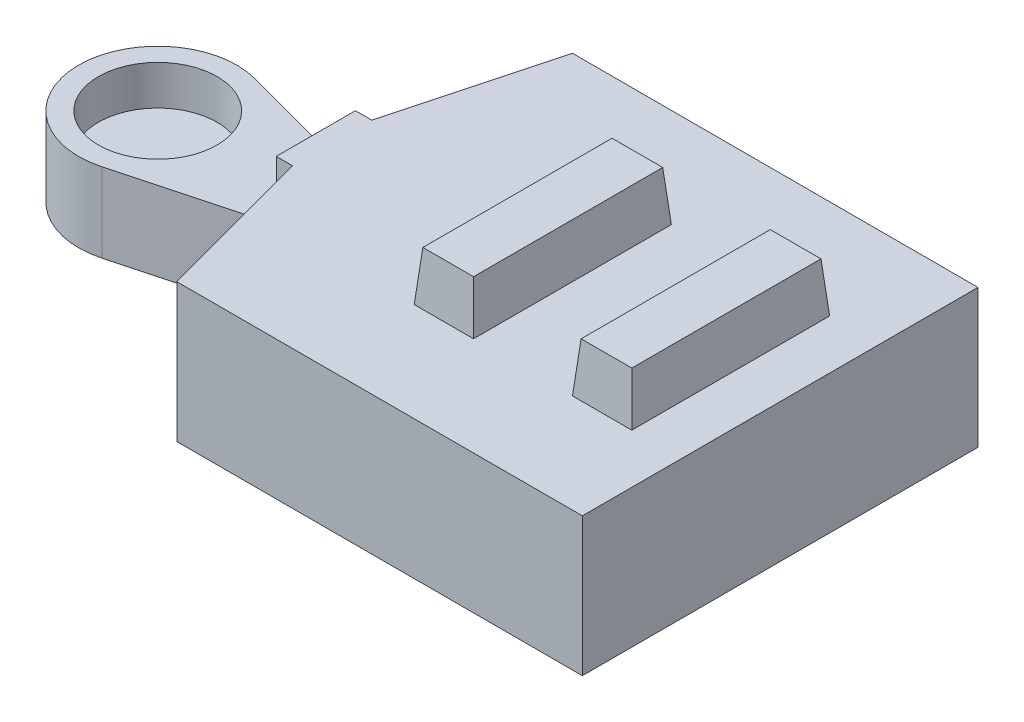
ISO-10303-21;
HEADER;
FILE_DESCRIPTION(('STEP AP214'),'2;1');
FILE_NAME('part.step','',(''),(''),'','','');
FILE_SCHEMA(('AUTOMOTIVE_DESIGN { 1 0 10303 214 1 1 1 1 }'));
ENDSEC;
DATA;
#1=APPLICATION_CONTEXT('core data for automotive mechanical design processes');
#2=APPLICATION_PROTOCOL_DEFINITION('international standard','automotive_design',2000,#1);
#3=PRODUCT_CONTEXT('',#1,'mechanical');
#4=PRODUCT('Part','Part','',(#3));
#5=PRODUCT_RELATED_PRODUCT_CATEGORY('part','',(#4));
#6=PRODUCT_DEFINITION_FORMATION('','',#4);
#7=PRODUCT_DEFINITION_CONTEXT('part definition',#1,'design');
#8=PRODUCT_DEFINITION('design','',#6,#7);
#9=PRODUCT_DEFINITION_SHAPE('','',#8);
#10=(LENGTH_UNIT() NAMED_UNIT(*) SI_UNIT(.MILLI.,.METRE.));
#11=(NAMED_UNIT(*) PLANE_ANGLE_UNIT() SI_UNIT($,.RADIAN.));
#12=(NAMED_UNIT(*) SI_UNIT($,.STERADIAN.) SOLID_ANGLE_UNIT());
#13=UNCERTAINTY_MEASURE_WITH_UNIT(LENGTH_MEASURE(1.E-05),#10,'distance_accuracy_value','');
#14=(GEOMETRIC_REPRESENTATION_CONTEXT(3) GLOBAL_UNCERTAINTY_ASSIGNED_CONTEXT((#13)) GLOBAL_UNIT_ASSIGNED_CONTEXT((#10,
#11,#12)) REPRESENTATION_CONTEXT('',''));
#15=CARTESIAN_POINT('',(0.,0.,0.));
#16=DIRECTION('',(0.,0.,1.));
#17=DIRECTION('',(1.,0.,0.));
#18=AXIS2_PLACEMENT_3D('',#15,#16,#17);
#19=CARTESIAN_POINT('',(0.,9.5,0.));
#20=DIRECTION('',(0.,1.,0.));
#21=DIRECTION('',(0.,0.,1.));
#22=AXIS2_PLACEMENT_3D('',#19,#20,#21);
#23=PLANE('',#22);
#24=DIRECTION('',(1.,0.,0.));
#25=VECTOR('',#24,1.);
#26=CARTESIAN_POINT('',(-4.,9.5,4.78127834118521));
#27=LINE('',#26,#25);
#28=CARTESIAN_POINT('',(26.1828232739526,9.5,4.78127834118521));
#29=VERTEX_POINT('',#28);
#30=CARTESIAN_POINT('',(28.745379956323,9.5,4.78127834118521));
#31=VERTEX_POINT('',#30);
#32=EDGE_CURVE('E322',#29,#31,#27,.T.);
#33=ORIENTED_EDGE('',*,*,#32,.T.);
#34=DIRECTION('',(0.,0.,-1.));
#35=VECTOR('',#34,1.);
#36=CARTESIAN_POINT('',(28.745379956323,9.5,7.50954959385838));
#37=LINE('',#36,#35);
#38=CARTESIAN_POINT('',(28.745379956323,9.5,-4.78127834118518));
#39=VERTEX_POINT('',#38);
#40=EDGE_CURVE('E332',#31,#39,#37,.T.);
#41=ORIENTED_EDGE('',*,*,#40,.T.);
#42=DIRECTION('',(1.,0.,0.));
#43=VECTOR('',#42,1.);
#44=CARTESIAN_POINT('',(-4.,9.5,-4.78127834118518));
#45=LINE('',#44,#43);
#46=CARTESIAN_POINT('',(26.1828232739526,9.5,-4.78127834118518));
#47=VERTEX_POINT('',#46);
#48=EDGE_CURVE('E62',#47,#39,#45,.T.);
#49=ORIENTED_EDGE('',*,*,#48,.F.);
#50=DIRECTION('',(0.,0.,-1.));
#51=VECTOR('',#50,1.);
#52=CARTESIAN_POINT('',(26.1828232739526,9.5,7.50954959385838));
#53=LINE('',#52,#51);
#54=EDGE_CURVE('E317',#29,#47,#53,.T.);
#55=ORIENTED_EDGE('',*,*,#54,.F.);
#56=EDGE_LOOP('',(#33,#41,#49,#55));
#57=FACE_BOUND('',#56,.T.);
#58=ADVANCED_FACE('F39',(#57),#23,.T.);
#59=CARTESIAN_POINT('',(0.,9.5,0.));
#60=DIRECTION('',(0.,1.,0.));
#61=DIRECTION('',(0.,0.,1.));
#62=AXIS2_PLACEMENT_3D('',#59,#60,#61);
#63=PLANE('',#62);
#64=CARTESIAN_POINT('',(18.1828232739526,9.5,4.78127834118521));
#65=VERTEX_POINT('',#64);
#66=CARTESIAN_POINT('',(20.745379956323,9.5,4.78127834118521));
#67=VERTEX_POINT('',#66);
#68=EDGE_CURVE('E318',#65,#67,#27,.T.);
#69=ORIENTED_EDGE('',*,*,#68,.T.);
#70=DIRECTION('',(0.,0.,-1.));
#71=VECTOR('',#70,1.);
#72=CARTESIAN_POINT('',(20.745379956323,9.5,7.50954959385838));
#73=LINE('',#72,#71);
#74=CARTESIAN_POINT('',(20.745379956323,9.5,-4.78127834118518));
#75=VERTEX_POINT('',#74);
#76=EDGE_CURVE('E335',#67,#75,#73,.T.);
#77=ORIENTED_EDGE('',*,*,#76,.T.);
#78=CARTESIAN_POINT('',(18.1828232739526,9.5,-4.78127834118518));
#79=VERTEX_POINT('',#78);
#80=EDGE_CURVE('E54',#79,#75,#45,.T.);
#81=ORIENTED_EDGE('',*,*,#80,.F.);
#82=DIRECTION('',(0.,0.,-1.));
#83=VECTOR('',#82,1.);
#84=CARTESIAN_POINT('',(18.1828232739526,9.5,7.50954959385838));
#85=LINE('',#84,#83);
#86=EDGE_CURVE('E187',#65,#79,#85,.T.);
#87=ORIENTED_EDGE('',*,*,#86,.F.);
#88=EDGE_LOOP('',(#69,#77,#81,#87));
#89=FACE_BOUND('',#88,.T.);
#90=ADVANCED_FACE('F344',(#89),#63,.T.);
#91=CARTESIAN_POINT('',(17.9641016151378,7.,7.50954959385838));
#92=DIRECTION('',(0.996194698091746,-0.0871557427476526,0.));
#93=DIRECTION('',(0.0871557427476526,0.996194698091746,0.));
#94=AXIS2_PLACEMENT_3D('',#91,#92,#93);
#95=PLANE('',#94);
#96=DIRECTION('',(0.,0.,1.));
#97=VECTOR('',#96,1.);
#98=CARTESIAN_POINT('',(17.9641016151378,7.,-5.));
#99=LINE('',#98,#97);
#100=CARTESIAN_POINT('',(17.9641016151378,7.,-4.99999999999999));
#101=VERTEX_POINT('',#100);
#102=CARTESIAN_POINT('',(17.9641016151378,7.,5.00000000000001));
#103=VERTEX_POINT('',#102);
#104=EDGE_CURVE('E177',#101,#103,#99,.T.);
#105=ORIENTED_EDGE('',*,*,#104,.T.);
#106=DIRECTION('',(0.0868265938642421,0.992432509138968,-0.0868265938642407));
#107=VECTOR('',#106,1.);
#108=CARTESIAN_POINT('',(17.9451824786062,6.78375327992174,5.01891913653152));
#109=LINE('',#108,#107);
#110=EDGE_CURVE('E330',#103,#65,#109,.T.);
#111=ORIENTED_EDGE('',*,*,#110,.T.);
#112=ORIENTED_EDGE('',*,*,#86,.T.);
#113=DIRECTION('',(0.086826593864242,0.992432509138967,0.0868265938642482));
#114=VECTOR('',#113,1.);
#115=CARTESIAN_POINT('',(18.0584093256899,8.07794206416514,-4.90569228944781));
#116=LINE('',#115,#114);
#117=EDGE_CURVE('E171',#101,#79,#116,.T.);
#118=ORIENTED_EDGE('',*,*,#117,.F.);
#119=EDGE_LOOP('',(#105,#111,#112,#118));
#120=FACE_BOUND('',#119,.T.);
#121=ADVANCED_FACE('F183',(#120),#95,.F.);
#122=CARTESIAN_POINT('',(20.9641016151378,7.,7.50954959385838));
#123=DIRECTION('',(-0.996194698091746,-0.0871557427476512,0.));
#124=DIRECTION('',(0.0871557427476512,-0.996194698091746,0.));
#125=AXIS2_PLACEMENT_3D('',#122,#123,#124);
#126=PLANE('',#125);
#127=ORIENTED_EDGE('',*,*,#76,.F.);
#128=DIRECTION('',(0.0868265938642407,-0.992432509138968,0.0868265938642407));
#129=VECTOR('',#128,1.);
#130=CARTESIAN_POINT('',(20.9830207516693,6.78375327992174,5.01891913653152));
#131=LINE('',#130,#129);
#132=CARTESIAN_POINT('',(20.9641016151378,7.,5.00000000000001));
#133=VERTEX_POINT('',#132);
#134=EDGE_CURVE('E327',#67,#133,#131,.T.);
#135=ORIENTED_EDGE('',*,*,#134,.T.);
#136=DIRECTION('',(0.,0.,-1.));
#137=VECTOR('',#136,1.);
#138=CARTESIAN_POINT('',(20.9641016151378,7.,-5.));
#139=LINE('',#138,#137);
#140=CARTESIAN_POINT('',(20.9641016151378,7.,-4.99999999999999));
#141=VERTEX_POINT('',#140);
#142=EDGE_CURVE('E178',#133,#141,#139,.T.);
#143=ORIENTED_EDGE('',*,*,#142,.T.);
#144=DIRECTION('',(0.0868265938642407,-0.992432509138968,-0.0868265938642482));
#145=VECTOR('',#144,1.);
#146=CARTESIAN_POINT('',(20.8697939045856,8.07794206416514,-4.90569228944781));
#147=LINE('',#146,#145);
#148=EDGE_CURVE('E172',#75,#141,#147,.T.);
#149=ORIENTED_EDGE('',*,*,#148,.F.);
#150=EDGE_LOOP('',(#127,#135,#143,#149));
#151=FACE_BOUND('',#150,.T.);
#152=ADVANCED_FACE('F340',(#151),#126,.F.);
#153=CARTESIAN_POINT('',(25.9641016151378,7.,7.50954959385838));
#154=DIRECTION('',(0.996194698091746,-0.0871557427476512,0.));
#155=DIRECTION('',(0.0871557427476512,0.996194698091746,0.));
#156=AXIS2_PLACEMENT_3D('',#153,#154,#155);
#157=PLANE('',#156);
#158=DIRECTION('',(0.,0.,1.));
#159=VECTOR('',#158,1.);
#160=CARTESIAN_POINT('',(25.9641016151378,7.,-4.99999999999999));
#161=LINE('',#160,#159);
#162=CARTESIAN_POINT('',(25.9641016151378,7.,-4.99999999999999));
#163=VERTEX_POINT('',#162);
#164=CARTESIAN_POINT('',(25.9641016151378,7.,5.00000000000001));
#165=VERTEX_POINT('',#164);
#166=EDGE_CURVE('E202',#163,#165,#161,.T.);
#167=ORIENTED_EDGE('',*,*,#166,.T.);
#168=DIRECTION('',(0.0868265938642407,0.992432509138968,-0.0868265938642407));
#169=VECTOR('',#168,1.);
#170=CARTESIAN_POINT('',(25.9451824786062,6.78375327992174,5.01891913653152));
#171=LINE('',#170,#169);
#172=EDGE_CURVE('E188',#165,#29,#171,.T.);
#173=ORIENTED_EDGE('',*,*,#172,.T.);
#174=ORIENTED_EDGE('',*,*,#54,.T.);
#175=DIRECTION('',(0.0868265938642407,0.992432509138968,0.0868265938642482));
#176=VECTOR('',#175,1.);
#177=CARTESIAN_POINT('',(26.0584093256899,8.07794206416514,-4.90569228944781));
#178=LINE('',#177,#176);
#179=EDGE_CURVE('E316',#163,#47,#178,.T.);
#180=ORIENTED_EDGE('',*,*,#179,.F.);
#181=EDGE_LOOP('',(#167,#173,#174,#180));
#182=FACE_BOUND('',#181,.T.);
#183=ADVANCED_FACE('F313',(#182),#157,.F.);
#184=CARTESIAN_POINT('',(28.9641016151378,7.,7.50954959385838));
#185=DIRECTION('',(-0.996194698091746,-0.0871557427476512,0.));
#186=DIRECTION('',(0.0871557427476512,-0.996194698091746,0.));
#187=AXIS2_PLACEMENT_3D('',#184,#185,#186);
#188=PLANE('',#187);
#189=ORIENTED_EDGE('',*,*,#40,.F.);
#190=DIRECTION('',(0.0868265938642407,-0.992432509138968,0.0868265938642407));
#191=VECTOR('',#190,1.);
#192=CARTESIAN_POINT('',(28.9830207516693,6.78375327992174,5.01891913653152));
#193=LINE('',#192,#191);
#194=CARTESIAN_POINT('',(28.9641016151378,7.,5.00000000000001));
#195=VERTEX_POINT('',#194);
#196=EDGE_CURVE('E11',#31,#195,#193,.T.);
#197=ORIENTED_EDGE('',*,*,#196,.T.);
#198=DIRECTION('',(0.,0.,-1.));
#199=VECTOR('',#198,1.);
#200=CARTESIAN_POINT('',(28.9641016151378,7.,-4.99999999999999));
#201=LINE('',#200,#199);
#202=CARTESIAN_POINT('',(28.9641016151378,7.,-4.99999999999999));
#203=VERTEX_POINT('',#202);
#204=EDGE_CURVE('E194',#195,#203,#201,.T.);
#205=ORIENTED_EDGE('',*,*,#204,.T.);
#206=DIRECTION('',(0.0868265938642407,-0.992432509138968,-0.0868265938642482));
#207=VECTOR('',#206,1.);
#208=CARTESIAN_POINT('',(28.8697939045856,8.07794206416514,-4.90569228944781));
#209=LINE('',#208,#207);
#210=EDGE_CURVE('E47',#39,#203,#209,.T.);
#211=ORIENTED_EDGE('',*,*,#210,.F.);
#212=EDGE_LOOP('',(#189,#197,#205,#211));
#213=FACE_BOUND('',#212,.T.);
#214=ADVANCED_FACE('F307',(#213),#188,.F.);
#215=CARTESIAN_POINT('',(0.,7.,0.));
#216=DIRECTION('',(0.,-1.,0.));
#217=DIRECTION('',(0.,0.,-1.));
#218=AXIS2_PLACEMENT_3D('',#215,#216,#217);
#219=PLANE('',#218);
#220=DIRECTION('',(1.,0.,0.));
#221=VECTOR('',#220,1.);
#222=CARTESIAN_POINT('',(17.9641016151378,7.,5.));
#223=LINE('',#222,#221);
#224=EDGE_CURVE('E192',#103,#133,#223,.T.);
#225=ORIENTED_EDGE('',*,*,#224,.F.);
#226=ORIENTED_EDGE('',*,*,#104,.F.);
#227=DIRECTION('',(-1.,0.,0.));
#228=VECTOR('',#227,1.);
#229=CARTESIAN_POINT('',(17.9641016151378,7.,-5.));
#230=LINE('',#229,#228);
#231=EDGE_CURVE('E168',#141,#101,#230,.T.);
#232=ORIENTED_EDGE('',*,*,#231,.F.);
#233=ORIENTED_EDGE('',*,*,#142,.F.);
#234=EDGE_LOOP('',(#225,#226,#232,#233));
#235=FACE_BOUND('',#234,.T.);
#236=DIRECTION('',(1.,0.,0.));
#237=VECTOR('',#236,1.);
#238=CARTESIAN_POINT('',(25.9641016151378,7.,5.00000000000001));
#239=LINE('',#238,#237);
#240=EDGE_CURVE('E205',#165,#195,#239,.T.);
#241=ORIENTED_EDGE('',*,*,#240,.F.);
#242=ORIENTED_EDGE('',*,*,#166,.F.);
#243=DIRECTION('',(-1.,0.,0.));
#244=VECTOR('',#243,1.);
#245=CARTESIAN_POINT('',(25.9641016151378,7.,-4.99999999999999));
#246=LINE('',#245,#244);
#247=EDGE_CURVE('E200',#203,#163,#246,.T.);
#248=ORIENTED_EDGE('',*,*,#247,.F.);
#249=ORIENTED_EDGE('',*,*,#204,.F.);
#250=EDGE_LOOP('',(#241,#242,#248,#249));
#251=FACE_BOUND('',#250,.T.);
#252=DIRECTION('',(-0.258819045102522,0.,0.965925826289068));
#253=VECTOR('',#252,1.);
#254=CARTESIAN_POINT('',(8.81810782814292,7.,-2.));
#255=LINE('',#254,#253);
#256=CARTESIAN_POINT('',(10.9617013675919,7.,-10.));
#257=VERTEX_POINT('',#256);
#258=CARTESIAN_POINT('',(8.81810782814292,7.,-2.));
#259=VERTEX_POINT('',#258);
#260=EDGE_CURVE('E224',#257,#259,#255,.T.);
#261=ORIENTED_EDGE('',*,*,#260,.T.);
#262=DIRECTION('',(-1.,0.,0.));
#263=VECTOR('',#262,1.);
#264=CARTESIAN_POINT('',(7.99071160548733,7.,-2.));
#265=LINE('',#264,#263);
#266=CARTESIAN_POINT('',(7.99071160548733,7.,-2.));
#267=VERTEX_POINT('',#266);
#268=EDGE_CURVE('E226',#259,#267,#265,.T.);
#269=ORIENTED_EDGE('',*,*,#268,.T.);
#270=DIRECTION('',(0.,0.,1.));
#271=VECTOR('',#270,1.);
#272=CARTESIAN_POINT('',(7.99071160548733,7.,2.));
#273=LINE('',#272,#271);
#274=CARTESIAN_POINT('',(7.99071160548733,7.,2.));
#275=VERTEX_POINT('',#274);
#276=EDGE_CURVE('E216',#267,#275,#273,.T.);
#277=ORIENTED_EDGE('',*,*,#276,.T.);
#278=DIRECTION('',(1.,0.,0.));
#279=VECTOR('',#278,1.);
#280=CARTESIAN_POINT('',(7.99071160548733,7.,2.));
#281=LINE('',#280,#279);
#282=CARTESIAN_POINT('',(8.81810782814292,7.,2.));
#283=VERTEX_POINT('',#282);
#284=EDGE_CURVE('E219',#275,#283,#281,.T.);
#285=ORIENTED_EDGE('',*,*,#284,.T.);
#286=DIRECTION('',(0.258819045102522,0.,0.965925826289068));
#287=VECTOR('',#286,1.);
#288=CARTESIAN_POINT('',(8.81810782814292,7.,2.));
#289=LINE('',#288,#287);
#290=CARTESIAN_POINT('',(10.9617013675919,7.,10.));
#291=VERTEX_POINT('',#290);
#292=EDGE_CURVE('E222',#283,#291,#289,.T.);
#293=ORIENTED_EDGE('',*,*,#292,.T.);
#294=DIRECTION('',(-1.,0.,0.));
#295=VECTOR('',#294,1.);
#296=CARTESIAN_POINT('',(10.9617013675919,7.,10.));
#297=LINE('',#296,#295);
#298=CARTESIAN_POINT('',(31.4641016151378,7.,10.));
#299=VERTEX_POINT('',#298);
#300=EDGE_CURVE('E207',#299,#291,#297,.T.);
#301=ORIENTED_EDGE('',*,*,#300,.F.);
#302=DIRECTION('',(0.,0.,1.));
#303=VECTOR('',#302,1.);
#304=CARTESIAN_POINT('',(31.4641016151378,7.,-10.));
#305=LINE('',#304,#303);
#306=CARTESIAN_POINT('',(31.4641016151378,7.,-10.));
#307=VERTEX_POINT('',#306);
#308=EDGE_CURVE('E211',#307,#299,#305,.T.);
#309=ORIENTED_EDGE('',*,*,#308,.F.);
#310=DIRECTION('',(1.,0.,0.));
#311=VECTOR('',#310,1.);
#312=CARTESIAN_POINT('',(10.9617013675919,7.,-10.));
#313=LINE('',#312,#311);
#314=EDGE_CURVE('E208',#257,#307,#313,.T.);
#315=ORIENTED_EDGE('',*,*,#314,.F.);
#316=EDGE_LOOP('',(#261,#269,#277,#285,#293,#301,#309,#315));
#317=FACE_BOUND('',#316,.T.);
#318=ADVANCED_FACE('F190',(#235,#251,#317),#219,.F.);
#319=CARTESIAN_POINT('',(0.,4.,0.));
#320=DIRECTION('',(0.,1.,0.));
#321=DIRECTION('',(0.,0.,1.));
#322=AXIS2_PLACEMENT_3D('',#319,#320,#321);
#323=PLANE('',#322);
#324=DIRECTION('',(0.,0.,1.));
#325=VECTOR('',#324,1.);
#326=CARTESIAN_POINT('',(7.99071160548733,4.,2.));
#327=LINE('',#326,#325);
#328=CARTESIAN_POINT('',(7.99071160548733,4.,-2.));
#329=VERTEX_POINT('',#328);
#330=CARTESIAN_POINT('',(7.99071160548733,4.,2.));
#331=VERTEX_POINT('',#330);
#332=EDGE_CURVE('E213',#329,#331,#327,.T.);
#333=ORIENTED_EDGE('',*,*,#332,.F.);
#334=DIRECTION('',(0.965925826289068,0.,0.258819045102522));
#335=VECTOR('',#334,1.);
#336=CARTESIAN_POINT('',(1.03527618041009,4.,-3.86370330515627));
#337=LINE('',#336,#335);
#338=CARTESIAN_POINT('',(1.03527618041009,4.,-3.86370330515627));
#339=VERTEX_POINT('',#338);
#340=EDGE_CURVE('E249',#339,#329,#337,.T.);
#341=ORIENTED_EDGE('',*,*,#340,.F.);
#342=CARTESIAN_POINT('',(0.,4.,0.));
#343=DIRECTION('',(0.,1.,0.));
#344=DIRECTION('',(0.,0.,1.));
#345=AXIS2_PLACEMENT_3D('',#342,#343,#344);
#346=CIRCLE('',#345,4.);
#347=CARTESIAN_POINT('',(1.03527618041009,4.,3.86370330515627));
#348=VERTEX_POINT('',#347);
#349=EDGE_CURVE('E243',#339,#348,#346,.T.);
#350=ORIENTED_EDGE('',*,*,#349,.T.);
#351=DIRECTION('',(0.965925826289068,0.,-0.258819045102522));
#352=VECTOR('',#351,1.);
#353=CARTESIAN_POINT('',(1.03527618041009,4.,3.86370330515627));
#354=LINE('',#353,#352);
#355=EDGE_CURVE('E246',#348,#331,#354,.T.);
#356=ORIENTED_EDGE('',*,*,#355,.T.);
#357=EDGE_LOOP('',(#333,#341,#350,#356));
#358=FACE_BOUND('',#357,.T.);
#359=CARTESIAN_POINT('',(0.,4.,0.));
#360=DIRECTION('',(0.,1.,0.));
#361=DIRECTION('',(0.,0.,1.));
#362=AXIS2_PLACEMENT_3D('',#359,#360,#361);
#363=CIRCLE('',#362,3.);
#364=CARTESIAN_POINT('',(0.,4.,3.));
#365=VERTEX_POINT('',#364);
#366=EDGE_CURVE('E236',#365,#365,#363,.T.);
#367=ORIENTED_EDGE('',*,*,#366,.F.);
#368=EDGE_LOOP('',(#367));
#369=FACE_BOUND('',#368,.T.);
#370=ADVANCED_FACE('F368',(#358,#369),#323,.T.);
#371=CARTESIAN_POINT('',(0.,4.,0.));
#372=DIRECTION('',(0.,-1.,0.));
#373=DIRECTION('',(0.,0.,-1.));
#374=AXIS2_PLACEMENT_3D('',#371,#372,#373);
#375=CYLINDRICAL_SURFACE('',#374,4.);
#376=CARTESIAN_POINT('',(0.,0.,0.));
#377=DIRECTION('',(0.,1.,0.));
#378=DIRECTION('',(0.,0.,1.));
#379=AXIS2_PLACEMENT_3D('',#376,#377,#378);
#380=CIRCLE('',#379,4.);
#381=CARTESIAN_POINT('',(1.03527618041009,0.,-3.86370330515627));
#382=VERTEX_POINT('',#381);
#383=CARTESIAN_POINT('',(1.03527618041009,0.,3.86370330515627));
#384=VERTEX_POINT('',#383);
#385=EDGE_CURVE('E240',#382,#384,#380,.T.);
#386=ORIENTED_EDGE('',*,*,#385,.T.);
#387=DIRECTION('',(0.,-1.,0.));
#388=VECTOR('',#387,1.);
#389=CARTESIAN_POINT('',(1.03527618041009,4.,3.86370330515627));
#390=LINE('',#389,#388);
#391=EDGE_CURVE('E298',#348,#384,#390,.T.);
#392=ORIENTED_EDGE('',*,*,#391,.F.);
#393=ORIENTED_EDGE('',*,*,#349,.F.);
#394=DIRECTION('',(0.,-1.,0.));
#395=VECTOR('',#394,1.);
#396=CARTESIAN_POINT('',(1.03527618041009,4.,-3.86370330515627));
#397=LINE('',#396,#395);
#398=EDGE_CURVE('E252',#339,#382,#397,.T.);
#399=ORIENTED_EDGE('',*,*,#398,.T.);
#400=EDGE_LOOP('',(#386,#392,#393,#399));
#401=FACE_BOUND('',#400,.T.);
#402=ADVANCED_FACE('F41',(#401),#375,.T.);
#403=CARTESIAN_POINT('',(1.03527618041009,4.,3.86370330515627));
#404=DIRECTION('',(-0.258819045102522,0.,-0.965925826289068));
#405=DIRECTION('',(-0.965925826289068,0.,0.258819045102522));
#406=AXIS2_PLACEMENT_3D('',#403,#404,#405);
#407=PLANE('',#406);
#408=DIRECTION('',(0.965925826289068,0.,-0.258819045102522));
#409=VECTOR('',#408,1.);
#410=CARTESIAN_POINT('',(1.03527618041009,0.,3.86370330515627));
#411=LINE('',#410,#409);
#412=CARTESIAN_POINT('',(7.99071160548733,0.,2.));
#413=VERTEX_POINT('',#412);
#414=EDGE_CURVE('E255',#384,#413,#411,.T.);
#415=ORIENTED_EDGE('',*,*,#414,.T.);
#416=DIRECTION('',(0.,-1.,0.));
#417=VECTOR('',#416,1.);
#418=CARTESIAN_POINT('',(7.99071160548733,4.,2.));
#419=LINE('',#418,#417);
#420=EDGE_CURVE('E295',#331,#413,#419,.T.);
#421=ORIENTED_EDGE('',*,*,#420,.F.);
#422=ORIENTED_EDGE('',*,*,#355,.F.);
#423=ORIENTED_EDGE('',*,*,#391,.T.);
#424=EDGE_LOOP('',(#415,#421,#422,#423));
#425=FACE_BOUND('',#424,.T.);
#426=ADVANCED_FACE('F417',(#425),#407,.F.);
#427=CARTESIAN_POINT('',(0.,4.,1.99999999999996));
#428=DIRECTION('',(0.,0.,-1.));
#429=DIRECTION('',(-1.,0.,0.));
#430=AXIS2_PLACEMENT_3D('',#427,#428,#429);
#431=PLANE('',#430);
#432=DIRECTION('',(1.,0.,0.));
#433=VECTOR('',#432,1.);
#434=CARTESIAN_POINT('',(0.,0.,1.99999999999996));
#435=LINE('',#434,#433);
#436=CARTESIAN_POINT('',(8.81810782814292,0.,2.));
#437=VERTEX_POINT('',#436);
#438=EDGE_CURVE('E257',#413,#437,#435,.T.);
#439=ORIENTED_EDGE('',*,*,#438,.T.);
#440=DIRECTION('',(0.,-1.,0.));
#441=VECTOR('',#440,1.);
#442=CARTESIAN_POINT('',(8.81810782814292,4.,2.));
#443=LINE('',#442,#441);
#444=EDGE_CURVE('E292',#283,#437,#443,.T.);
#445=ORIENTED_EDGE('',*,*,#444,.F.);
#446=ORIENTED_EDGE('',*,*,#284,.F.);
#447=DIRECTION('',(0.,-1.,0.));
#448=VECTOR('',#447,1.);
#449=CARTESIAN_POINT('',(7.99071160548733,7.,2.));
#450=LINE('',#449,#448);
#451=EDGE_CURVE('E233',#275,#331,#450,.T.);
#452=ORIENTED_EDGE('',*,*,#451,.T.);
#453=ORIENTED_EDGE('',*,*,#420,.T.);
#454=EDGE_LOOP('',(#439,#445,#446,#452,#453));
#455=FACE_BOUND('',#454,.T.);
#456=ADVANCED_FACE('F414',(#455),#431,.F.);
#457=CARTESIAN_POINT('',(7.72740661031255,4.,-2.07055236082017));
#458=DIRECTION('',(0.965925826289068,0.,-0.258819045102521));
#459=DIRECTION('',(-0.258819045102521,0.,-0.965925826289068));
#460=AXIS2_PLACEMENT_3D('',#457,#458,#459);
#461=PLANE('',#460);
#462=DIRECTION('',(0.258819045102521,0.,0.965925826289068));
#463=VECTOR('',#462,1.);
#464=CARTESIAN_POINT('',(7.72740661031255,0.,-2.07055236082017));
#465=LINE('',#464,#463);
#466=CARTESIAN_POINT('',(10.9617013675919,0.,10.));
#467=VERTEX_POINT('',#466);
#468=EDGE_CURVE('E259',#437,#467,#465,.T.);
#469=ORIENTED_EDGE('',*,*,#468,.T.);
#470=DIRECTION('',(0.,-1.,0.));
#471=VECTOR('',#470,1.);
#472=CARTESIAN_POINT('',(10.9617013675919,4.,10.));
#473=LINE('',#472,#471);
#474=EDGE_CURVE('E289',#291,#467,#473,.T.);
#475=ORIENTED_EDGE('',*,*,#474,.F.);
#476=ORIENTED_EDGE('',*,*,#292,.F.);
#477=ORIENTED_EDGE('',*,*,#444,.T.);
#478=EDGE_LOOP('',(#469,#475,#476,#477));
#479=FACE_BOUND('',#478,.T.);
#480=ADVANCED_FACE('F410',(#479),#461,.F.);
#481=CARTESIAN_POINT('',(0.,4.,10.));
#482=DIRECTION('',(0.,0.,-1.));
#483=DIRECTION('',(-1.,0.,0.));
#484=AXIS2_PLACEMENT_3D('',#481,#482,#483);
#485=PLANE('',#484);
#486=DIRECTION('',(1.,0.,0.));
#487=VECTOR('',#486,1.);
#488=CARTESIAN_POINT('',(0.,0.,10.));
#489=LINE('',#488,#487);
#490=CARTESIAN_POINT('',(31.4641016151378,0.,10.));
#491=VERTEX_POINT('',#490);
#492=EDGE_CURVE('E261',#467,#491,#489,.T.);
#493=ORIENTED_EDGE('',*,*,#492,.T.);
#494=DIRECTION('',(0.,-1.,0.));
#495=VECTOR('',#494,1.);
#496=CARTESIAN_POINT('',(31.4641016151378,4.,10.));
#497=LINE('',#496,#495);
#498=EDGE_CURVE('E287',#299,#491,#497,.T.);
#499=ORIENTED_EDGE('',*,*,#498,.F.);
#500=ORIENTED_EDGE('',*,*,#300,.T.);
#501=ORIENTED_EDGE('',*,*,#474,.T.);
#502=EDGE_LOOP('',(#493,#499,#500,#501));
#503=FACE_BOUND('',#502,.T.);
#504=ADVANCED_FACE('F406',(#503),#485,.F.);
#505=CARTESIAN_POINT('',(31.4641016151378,4.,0.));
#506=DIRECTION('',(1.,0.,0.));
#507=DIRECTION('',(0.,0.,-1.));
#508=AXIS2_PLACEMENT_3D('',#505,#506,#507);
#509=PLANE('',#508);
#510=DIRECTION('',(0.,0.,1.));
#511=VECTOR('',#510,1.);
#512=CARTESIAN_POINT('',(31.4641016151378,0.,0.));
#513=LINE('',#512,#511);
#514=CARTESIAN_POINT('',(31.4641016151378,0.,-10.));
#515=VERTEX_POINT('',#514);
#516=EDGE_CURVE('E264',#515,#491,#513,.T.);
#517=ORIENTED_EDGE('',*,*,#516,.F.);
#518=DIRECTION('',(0.,-1.,0.));
#519=VECTOR('',#518,1.);
#520=CARTESIAN_POINT('',(31.4641016151378,4.,-10.));
#521=LINE('',#520,#519);
#522=EDGE_CURVE('E285',#307,#515,#521,.T.);
#523=ORIENTED_EDGE('',*,*,#522,.F.);
#524=ORIENTED_EDGE('',*,*,#308,.T.);
#525=ORIENTED_EDGE('',*,*,#498,.T.);
#526=EDGE_LOOP('',(#517,#523,#524,#525));
#527=FACE_BOUND('',#526,.T.);
#528=ADVANCED_FACE('F402',(#527),#509,.T.);
#529=CARTESIAN_POINT('',(0.,4.,-10.));
#530=DIRECTION('',(0.,0.,-1.));
#531=DIRECTION('',(-1.,0.,0.));
#532=AXIS2_PLACEMENT_3D('',#529,#530,#531);
#533=PLANE('',#532);
#534=DIRECTION('',(1.,0.,0.));
#535=VECTOR('',#534,1.);
#536=CARTESIAN_POINT('',(0.,0.,-10.));
#537=LINE('',#536,#535);
#538=CARTESIAN_POINT('',(10.9617013675919,0.,-10.));
#539=VERTEX_POINT('',#538);
#540=EDGE_CURVE('E267',#539,#515,#537,.T.);
#541=ORIENTED_EDGE('',*,*,#540,.F.);
#542=DIRECTION('',(0.,-1.,0.));
#543=VECTOR('',#542,1.);
#544=CARTESIAN_POINT('',(10.9617013675919,4.,-10.));
#545=LINE('',#544,#543);
#546=EDGE_CURVE('E283',#257,#539,#545,.T.);
#547=ORIENTED_EDGE('',*,*,#546,.F.);
#548=ORIENTED_EDGE('',*,*,#314,.T.);
#549=ORIENTED_EDGE('',*,*,#522,.T.);
#550=EDGE_LOOP('',(#541,#547,#548,#549));
#551=FACE_BOUND('',#550,.T.);
#552=ADVANCED_FACE('F398',(#551),#533,.T.);
#553=CARTESIAN_POINT('',(7.72740661031254,4.,2.07055236082017));
#554=DIRECTION('',(-0.965925826289068,0.,-0.258819045102522));
#555=DIRECTION('',(-0.258819045102522,0.,0.965925826289068));
#556=AXIS2_PLACEMENT_3D('',#553,#554,#555);
#557=PLANE('',#556);
#558=DIRECTION('',(0.258819045102522,0.,-0.965925826289068));
#559=VECTOR('',#558,1.);
#560=CARTESIAN_POINT('',(7.72740661031254,0.,2.07055236082017));
#561=LINE('',#560,#559);
#562=CARTESIAN_POINT('',(8.81810782814292,0.,-2.));
#563=VERTEX_POINT('',#562);
#564=EDGE_CURVE('E270',#563,#539,#561,.T.);
#565=ORIENTED_EDGE('',*,*,#564,.F.);
#566=DIRECTION('',(0.,-1.,0.));
#567=VECTOR('',#566,1.);
#568=CARTESIAN_POINT('',(8.81810782814292,4.,-2.));
#569=LINE('',#568,#567);
#570=EDGE_CURVE('E281',#259,#563,#569,.T.);
#571=ORIENTED_EDGE('',*,*,#570,.F.);
#572=ORIENTED_EDGE('',*,*,#260,.F.);
#573=ORIENTED_EDGE('',*,*,#546,.T.);
#574=EDGE_LOOP('',(#565,#571,#572,#573));
#575=FACE_BOUND('',#574,.T.);
#576=ADVANCED_FACE('F394',(#575),#557,.T.);
#577=CARTESIAN_POINT('',(0.,4.,-1.99999999999996));
#578=DIRECTION('',(0.,0.,-1.));
#579=DIRECTION('',(-1.,0.,0.));
#580=AXIS2_PLACEMENT_3D('',#577,#578,#579);
#581=PLANE('',#580);
#582=DIRECTION('',(1.,0.,0.));
#583=VECTOR('',#582,1.);
#584=CARTESIAN_POINT('',(0.,0.,-1.99999999999996));
#585=LINE('',#584,#583);
#586=CARTESIAN_POINT('',(7.99071160548733,0.,-2.));
#587=VERTEX_POINT('',#586);
#588=EDGE_CURVE('E273',#587,#563,#585,.T.);
#589=ORIENTED_EDGE('',*,*,#588,.F.);
#590=DIRECTION('',(0.,-1.,0.));
#591=VECTOR('',#590,1.);
#592=CARTESIAN_POINT('',(7.99071160548733,4.,-2.));
#593=LINE('',#592,#591);
#594=EDGE_CURVE('E279',#329,#587,#593,.T.);
#595=ORIENTED_EDGE('',*,*,#594,.F.);
#596=DIRECTION('',(0.,-1.,0.));
#597=VECTOR('',#596,1.);
#598=CARTESIAN_POINT('',(7.99071160548733,7.,-2.));
#599=LINE('',#598,#597);
#600=EDGE_CURVE('E228',#267,#329,#599,.T.);
#601=ORIENTED_EDGE('',*,*,#600,.F.);
#602=ORIENTED_EDGE('',*,*,#268,.F.);
#603=ORIENTED_EDGE('',*,*,#570,.T.);
#604=EDGE_LOOP('',(#589,#595,#601,#602,#603));
#605=FACE_BOUND('',#604,.T.);
#606=ADVANCED_FACE('F390',(#605),#581,.T.);
#607=CARTESIAN_POINT('',(1.03527618041009,4.,-3.86370330515627));
#608=DIRECTION('',(0.258819045102522,0.,-0.965925826289068));
#609=DIRECTION('',(-0.965925826289068,0.,-0.258819045102522));
#610=AXIS2_PLACEMENT_3D('',#607,#608,#609);
#611=PLANE('',#610);
#612=DIRECTION('',(0.965925826289068,0.,0.258819045102522));
#613=VECTOR('',#612,1.);
#614=CARTESIAN_POINT('',(1.03527618041009,0.,-3.86370330515627));
#615=LINE('',#614,#613);
#616=EDGE_CURVE('E247',#382,#587,#615,.T.);
#617=ORIENTED_EDGE('',*,*,#616,.F.);
#618=ORIENTED_EDGE('',*,*,#398,.F.);
#619=ORIENTED_EDGE('',*,*,#340,.T.);
#620=ORIENTED_EDGE('',*,*,#594,.T.);
#621=EDGE_LOOP('',(#617,#618,#619,#620));
#622=FACE_BOUND('',#621,.T.);
#623=ADVANCED_FACE('F386',(#622),#611,.T.);
#624=CARTESIAN_POINT('',(0.,0.,0.));
#625=DIRECTION('',(0.,1.,0.));
#626=DIRECTION('',(0.,0.,1.));
#627=AXIS2_PLACEMENT_3D('',#624,#625,#626);
#628=PLANE('',#627);
#629=ORIENTED_EDGE('',*,*,#385,.F.);
#630=ORIENTED_EDGE('',*,*,#616,.T.);
#631=ORIENTED_EDGE('',*,*,#588,.T.);
#632=ORIENTED_EDGE('',*,*,#564,.T.);
#633=ORIENTED_EDGE('',*,*,#540,.T.);
#634=ORIENTED_EDGE('',*,*,#516,.T.);
#635=ORIENTED_EDGE('',*,*,#492,.F.);
#636=ORIENTED_EDGE('',*,*,#468,.F.);
#637=ORIENTED_EDGE('',*,*,#438,.F.);
#638=ORIENTED_EDGE('',*,*,#414,.F.);
#639=EDGE_LOOP('',(#629,#630,#631,#632,#633,#634,#635,#636,#637,#638));
#640=FACE_BOUND('',#639,.T.);
#641=ADVANCED_FACE('F379',(#640),#628,.F.);
#642=CARTESIAN_POINT('',(0.,2.,0.));
#643=DIRECTION('',(0.,1.,0.));
#644=DIRECTION('',(0.,0.,1.));
#645=AXIS2_PLACEMENT_3D('',#642,#643,#644);
#646=CYLINDRICAL_SURFACE('',#645,3.);
#647=CARTESIAN_POINT('',(0.,2.,0.));
#648=DIRECTION('',(0.,1.,0.));
#649=DIRECTION('',(0.,0.,1.));
#650=AXIS2_PLACEMENT_3D('',#647,#648,#649);
#651=CIRCLE('',#650,3.);
#652=CARTESIAN_POINT('',(0.,2.,3.));
#653=VERTEX_POINT('',#652);
#654=EDGE_CURVE('E237',#653,#653,#651,.T.);
#655=ORIENTED_EDGE('',*,*,#654,.F.);
#656=EDGE_LOOP('',(#655));
#657=FACE_BOUND('',#656,.T.);
#658=ORIENTED_EDGE('',*,*,#366,.T.);
#659=EDGE_LOOP('',(#658));
#660=FACE_BOUND('',#659,.T.);
#661=ADVANCED_FACE('F375',(#657,#660),#646,.F.);
#662=CARTESIAN_POINT('',(0.,2.,0.));
#663=DIRECTION('',(0.,1.,0.));
#664=DIRECTION('',(0.,0.,1.));
#665=AXIS2_PLACEMENT_3D('',#662,#663,#664);
#666=PLANE('',#665);
#667=ORIENTED_EDGE('',*,*,#654,.T.);
#668=EDGE_LOOP('',(#667));
#669=FACE_BOUND('',#668,.T.);
#670=ADVANCED_FACE('F371',(#669),#666,.T.);
#671=CARTESIAN_POINT('',(7.99071160548733,7.,2.));
#672=DIRECTION('',(1.,0.,0.));
#673=DIRECTION('',(0.,0.,-1.));
#674=AXIS2_PLACEMENT_3D('',#671,#672,#673);
#675=PLANE('',#674);
#676=ORIENTED_EDGE('',*,*,#332,.T.);
#677=ORIENTED_EDGE('',*,*,#451,.F.);
#678=ORIENTED_EDGE('',*,*,#276,.F.);
#679=ORIENTED_EDGE('',*,*,#600,.T.);
#680=EDGE_LOOP('',(#676,#677,#678,#679));
#681=FACE_BOUND('',#680,.T.);
#682=ADVANCED_FACE('F356',(#681),#675,.F.);
#683=CARTESIAN_POINT('',(-4.,7.,-4.99999999999999));
#684=DIRECTION('',(0.,0.0871557427476588,-0.996194698091746));
#685=DIRECTION('',(0.,0.996194698091745,0.0871557427476588));
#686=AXIS2_PLACEMENT_3D('',#683,#684,#685);
#687=PLANE('',#686);
#688=ORIENTED_EDGE('',*,*,#179,.T.);
#689=ORIENTED_EDGE('',*,*,#48,.T.);
#690=ORIENTED_EDGE('',*,*,#210,.T.);
#691=ORIENTED_EDGE('',*,*,#247,.T.);
#692=EDGE_LOOP('',(#688,#689,#690,#691));
#693=FACE_BOUND('',#692,.T.);
#694=ADVANCED_FACE('F300',(#693),#687,.T.);
#695=CARTESIAN_POINT('',(-4.,7.,5.00000000000001));
#696=DIRECTION('',(0.,-0.0871557427476512,-0.996194698091746));
#697=DIRECTION('',(0.,0.996194698091746,-0.0871557427476512));
#698=AXIS2_PLACEMENT_3D('',#695,#696,#697);
#699=PLANE('',#698);
#700=ORIENTED_EDGE('',*,*,#240,.T.);
#701=ORIENTED_EDGE('',*,*,#196,.F.);
#702=ORIENTED_EDGE('',*,*,#32,.F.);
#703=ORIENTED_EDGE('',*,*,#172,.F.);
#704=EDGE_LOOP('',(#700,#701,#702,#703));
#705=FACE_BOUND('',#704,.T.);
#706=ADVANCED_FACE('F348',(#705),#699,.F.);
#707=ORIENTED_EDGE('',*,*,#117,.T.);
#708=ORIENTED_EDGE('',*,*,#80,.T.);
#709=ORIENTED_EDGE('',*,*,#148,.T.);
#710=ORIENTED_EDGE('',*,*,#231,.T.);
#711=EDGE_LOOP('',(#707,#708,#709,#710));
#712=FACE_BOUND('',#711,.T.);
#713=ADVANCED_FACE('F170',(#712),#687,.T.);
#714=ORIENTED_EDGE('',*,*,#224,.T.);
#715=ORIENTED_EDGE('',*,*,#134,.F.);
#716=ORIENTED_EDGE('',*,*,#68,.F.);
#717=ORIENTED_EDGE('',*,*,#110,.F.);
#718=EDGE_LOOP('',(#714,#715,#716,#717));
#719=FACE_BOUND('',#718,.T.);
#720=ADVANCED_FACE('F342',(#719),#699,.F.);
#721=CLOSED_SHELL('',(#58,#90,#121,#152,#183,#214,#318,#370,#402,#426,#456,#480,#504,#528,#552,
#576,#606,#623,#641,#661,#670,#682,#694,#706,#713,#720));
#722=MANIFOLD_SOLID_BREP('B2',#721);
#723=ADVANCED_BREP_SHAPE_REPRESENTATION('',(#18,#722),#14);
#724=SHAPE_DEFINITION_REPRESENTATION(#9,#723);
ENDSEC;
END-ISO-10303-21;
